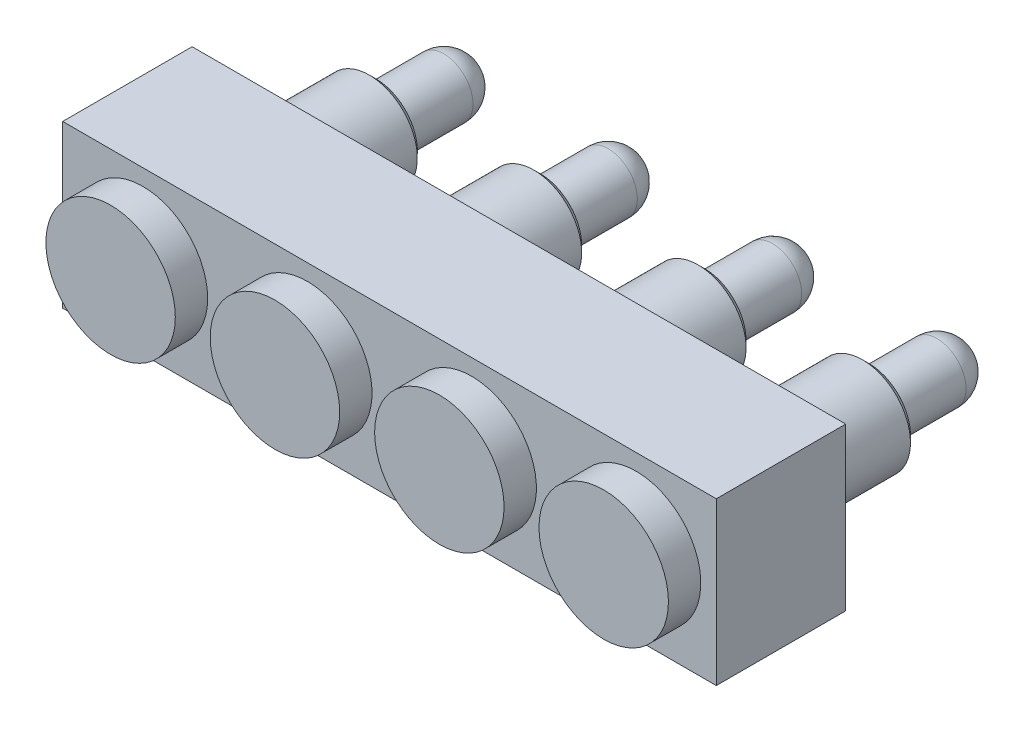
ISO-10303-21;
HEADER;
FILE_DESCRIPTION(('STEP AP214'),'2;1');
FILE_NAME('part.step','',(''),(''),'','','');
FILE_SCHEMA(('AUTOMOTIVE_DESIGN { 1 0 10303 214 1 1 1 1 }'));
ENDSEC;
DATA;
#1=APPLICATION_CONTEXT('core data for automotive mechanical design processes');
#2=APPLICATION_PROTOCOL_DEFINITION('international standard','automotive_design',2000,#1);
#3=PRODUCT_CONTEXT('',#1,'mechanical');
#4=PRODUCT('Part','Part','',(#3));
#5=PRODUCT_RELATED_PRODUCT_CATEGORY('part','',(#4));
#6=PRODUCT_DEFINITION_FORMATION('','',#4);
#7=PRODUCT_DEFINITION_CONTEXT('part definition',#1,'design');
#8=PRODUCT_DEFINITION('design','',#6,#7);
#9=PRODUCT_DEFINITION_SHAPE('','',#8);
#10=(LENGTH_UNIT() NAMED_UNIT(*) SI_UNIT(.MILLI.,.METRE.));
#11=(NAMED_UNIT(*) PLANE_ANGLE_UNIT() SI_UNIT($,.RADIAN.));
#12=(NAMED_UNIT(*) SI_UNIT($,.STERADIAN.) SOLID_ANGLE_UNIT());
#13=UNCERTAINTY_MEASURE_WITH_UNIT(LENGTH_MEASURE(1.E-05),#10,'distance_accuracy_value','');
#14=(GEOMETRIC_REPRESENTATION_CONTEXT(3) GLOBAL_UNCERTAINTY_ASSIGNED_CONTEXT((#13)) GLOBAL_UNIT_ASSIGNED_CONTEXT((#10,
#11,#12)) REPRESENTATION_CONTEXT('',''));
#15=CARTESIAN_POINT('',(0.,0.,0.));
#16=DIRECTION('',(0.,0.,1.));
#17=DIRECTION('',(1.,0.,0.));
#18=AXIS2_PLACEMENT_3D('',#15,#16,#17);
#19=CARTESIAN_POINT('',(8.86405892984329,1.25248156690926,-1.6));
#20=DIRECTION('',(0.,0.,1.));
#21=DIRECTION('',(1.,0.,0.));
#22=AXIS2_PLACEMENT_3D('',#19,#20,#21);
#23=CYLINDRICAL_SURFACE('',#22,0.74);
#24=CARTESIAN_POINT('',(8.86405892984329,1.25248156690926,-1.5));
#25=DIRECTION('',(0.,0.,-1.));
#26=DIRECTION('',(-1.,0.,0.));
#27=AXIS2_PLACEMENT_3D('',#24,#25,#26);
#28=CIRCLE('',#27,0.74);
#29=CARTESIAN_POINT('',(8.12405892984329,1.25248156690926,-1.5));
#30=VERTEX_POINT('',#29);
#31=EDGE_CURVE('E11',#30,#30,#28,.F.);
#32=ORIENTED_EDGE('',*,*,#31,.T.);
#33=EDGE_LOOP('',(#32));
#34=FACE_BOUND('',#33,.T.);
#35=CARTESIAN_POINT('',(8.86405892984329,1.25248156690926,0.));
#36=DIRECTION('',(0.,0.,-1.));
#37=DIRECTION('',(-1.,0.,0.));
#38=AXIS2_PLACEMENT_3D('',#35,#36,#37);
#39=CIRCLE('',#38,0.74);
#40=CARTESIAN_POINT('',(8.12405892984329,1.25248156690926,0.));
#41=VERTEX_POINT('',#40);
#42=EDGE_CURVE('E74',#41,#41,#39,.T.);
#43=ORIENTED_EDGE('',*,*,#42,.T.);
#44=EDGE_LOOP('',(#43));
#45=FACE_BOUND('',#44,.T.);
#46=ADVANCED_FACE('F58',(#34,#45),#23,.T.);
#47=CARTESIAN_POINT('',(8.86405892984329,1.25248156690926,-1.6));
#48=DIRECTION('',(0.,0.,-1.));
#49=DIRECTION('',(-1.,0.,0.));
#50=AXIS2_PLACEMENT_3D('',#47,#48,#49);
#51=PLANE('',#50);
#52=CARTESIAN_POINT('',(8.86405892984329,1.25248156690926,-1.6));
#53=DIRECTION('',(0.,0.,-1.));
#54=DIRECTION('',(-1.,0.,0.));
#55=AXIS2_PLACEMENT_3D('',#52,#53,#54);
#56=CIRCLE('',#55,0.64);
#57=CARTESIAN_POINT('',(8.22405892984329,1.25248156690926,-1.6));
#58=VERTEX_POINT('',#57);
#59=EDGE_CURVE('E66',#58,#58,#56,.T.);
#60=ORIENTED_EDGE('',*,*,#59,.T.);
#61=EDGE_LOOP('',(#60));
#62=FACE_BOUND('',#61,.T.);
#63=CARTESIAN_POINT('',(8.86405892984329,1.25248156690931,-1.6));
#64=DIRECTION('',(0.,0.,-1.));
#65=DIRECTION('',(-1.,0.,0.));
#66=AXIS2_PLACEMENT_3D('',#63,#64,#65);
#67=CIRCLE('',#66,0.45);
#68=CARTESIAN_POINT('',(8.41405892984329,1.25248156690931,-1.6));
#69=VERTEX_POINT('',#68);
#70=EDGE_CURVE('E79',#69,#69,#67,.F.);
#71=ORIENTED_EDGE('',*,*,#70,.T.);
#72=EDGE_LOOP('',(#71));
#73=FACE_BOUND('',#72,.T.);
#74=ADVANCED_FACE('F83',(#62,#73),#51,.T.);
#75=CARTESIAN_POINT('',(8.86405892984329,1.25248156690926,0.));
#76=DIRECTION('',(0.,0.,-1.));
#77=DIRECTION('',(-1.,0.,0.));
#78=AXIS2_PLACEMENT_3D('',#75,#76,#77);
#79=PLANE('',#78);
#80=ORIENTED_EDGE('',*,*,#42,.F.);
#81=EDGE_LOOP('',(#80));
#82=FACE_BOUND('',#81,.T.);
#83=ADVANCED_FACE('F88',(#82),#79,.F.);
#84=CARTESIAN_POINT('',(8.86405892984329,1.25248156690931,-3.1));
#85=DIRECTION('',(0.,0.,1.));
#86=DIRECTION('',(1.,0.,0.));
#87=AXIS2_PLACEMENT_3D('',#84,#85,#86);
#88=CYLINDRICAL_SURFACE('',#87,0.45);
#89=CARTESIAN_POINT('',(8.86405892984329,1.25248156690931,-2.65));
#90=DIRECTION('',(0.,0.,1.));
#91=DIRECTION('',(1.,0.,0.));
#92=AXIS2_PLACEMENT_3D('',#89,#90,#91);
#93=CIRCLE('',#92,0.45);
#94=CARTESIAN_POINT('',(9.31405892984329,1.25248156690931,-2.65));
#95=VERTEX_POINT('',#94);
#96=EDGE_CURVE('E70',#95,#95,#93,.T.);
#97=ORIENTED_EDGE('',*,*,#96,.T.);
#98=EDGE_LOOP('',(#97));
#99=FACE_BOUND('',#98,.T.);
#100=ORIENTED_EDGE('',*,*,#70,.F.);
#101=EDGE_LOOP('',(#100));
#102=FACE_BOUND('',#101,.T.);
#103=ADVANCED_FACE('F85',(#99,#102),#88,.T.);
#104=CARTESIAN_POINT('',(8.86405892984329,1.25248156690931,-2.65));
#105=DIRECTION('',(0.,0.,-1.));
#106=DIRECTION('',(-1.,0.,0.));
#107=AXIS2_PLACEMENT_3D('',#104,#105,#106);
#108=SPHERICAL_SURFACE('',#107,0.45);
#109=ORIENTED_EDGE('',*,*,#96,.F.);
#110=EDGE_LOOP('',(#109));
#111=FACE_BOUND('',#110,.T.);
#112=ADVANCED_FACE('F87',(#111),#108,.T.);
#113=CARTESIAN_POINT('',(8.86405892984329,1.25248156690926,-1.6));
#114=DIRECTION('',(0.,0.,1.));
#115=DIRECTION('',(1.,0.,0.));
#116=AXIS2_PLACEMENT_3D('',#113,#114,#115);
#117=CONICAL_SURFACE('',#116,0.64,0.78539816339744);
#118=ORIENTED_EDGE('',*,*,#31,.F.);
#119=EDGE_LOOP('',(#118));
#120=FACE_BOUND('',#119,.T.);
#121=ORIENTED_EDGE('',*,*,#59,.F.);
#122=EDGE_LOOP('',(#121));
#123=FACE_BOUND('',#122,.T.);
#124=ADVANCED_FACE('F61',(#120,#123),#117,.T.);
#125=CLOSED_SHELL('',(#46,#74,#83,#103,#112,#124));
#126=MANIFOLD_SOLID_BREP('B2',#125);
#127=CARTESIAN_POINT('',(6.32405892984329,1.25248156690928,-1.6));
#128=DIRECTION('',(0.,0.,1.));
#129=DIRECTION('',(1.,0.,0.));
#130=AXIS2_PLACEMENT_3D('',#127,#128,#129);
#131=CYLINDRICAL_SURFACE('',#130,0.740000000000001);
#132=CARTESIAN_POINT('',(6.32405892984329,1.25248156690928,-1.5));
#133=DIRECTION('',(0.,0.,-1.));
#134=DIRECTION('',(-1.,0.,0.));
#135=AXIS2_PLACEMENT_3D('',#132,#133,#134);
#136=CIRCLE('',#135,0.740000000000001);
#137=CARTESIAN_POINT('',(5.58405892984329,1.25248156690928,-1.5));
#138=VERTEX_POINT('',#137);
#139=EDGE_CURVE('E57',#138,#138,#136,.F.);
#140=ORIENTED_EDGE('',*,*,#139,.T.);
#141=EDGE_LOOP('',(#140));
#142=FACE_BOUND('',#141,.T.);
#143=CARTESIAN_POINT('',(6.32405892984329,1.25248156690928,0.));
#144=DIRECTION('',(0.,0.,-1.));
#145=DIRECTION('',(-1.,0.,0.));
#146=AXIS2_PLACEMENT_3D('',#143,#144,#145);
#147=CIRCLE('',#146,0.740000000000001);
#148=CARTESIAN_POINT('',(5.58405892984329,1.25248156690928,0.));
#149=VERTEX_POINT('',#148);
#150=EDGE_CURVE('E159',#149,#149,#147,.T.);
#151=ORIENTED_EDGE('',*,*,#150,.T.);
#152=EDGE_LOOP('',(#151));
#153=FACE_BOUND('',#152,.T.);
#154=ADVANCED_FACE('F143',(#142,#153),#131,.T.);
#155=CARTESIAN_POINT('',(6.32405892984329,1.25248156690928,-1.6));
#156=DIRECTION('',(0.,0.,-1.));
#157=DIRECTION('',(-1.,0.,0.));
#158=AXIS2_PLACEMENT_3D('',#155,#156,#157);
#159=PLANE('',#158);
#160=CARTESIAN_POINT('',(6.32405892984329,1.25248156690928,-1.6));
#161=DIRECTION('',(0.,0.,-1.));
#162=DIRECTION('',(-1.,0.,0.));
#163=AXIS2_PLACEMENT_3D('',#160,#161,#162);
#164=CIRCLE('',#163,0.640000000000002);
#165=CARTESIAN_POINT('',(5.68405892984329,1.25248156690928,-1.6));
#166=VERTEX_POINT('',#165);
#167=EDGE_CURVE('E151',#166,#166,#164,.T.);
#168=ORIENTED_EDGE('',*,*,#167,.T.);
#169=EDGE_LOOP('',(#168));
#170=FACE_BOUND('',#169,.T.);
#171=CARTESIAN_POINT('',(6.32405892984329,1.25248156690935,-1.6));
#172=DIRECTION('',(0.,0.,-1.));
#173=DIRECTION('',(-1.,0.,0.));
#174=AXIS2_PLACEMENT_3D('',#171,#172,#173);
#175=CIRCLE('',#174,0.45);
#176=CARTESIAN_POINT('',(5.87405892984329,1.25248156690935,-1.6));
#177=VERTEX_POINT('',#176);
#178=EDGE_CURVE('E164',#177,#177,#175,.F.);
#179=ORIENTED_EDGE('',*,*,#178,.T.);
#180=EDGE_LOOP('',(#179));
#181=FACE_BOUND('',#180,.T.);
#182=ADVANCED_FACE('F168',(#170,#181),#159,.T.);
#183=CARTESIAN_POINT('',(6.32405892984329,1.25248156690928,0.));
#184=DIRECTION('',(0.,0.,-1.));
#185=DIRECTION('',(-1.,0.,0.));
#186=AXIS2_PLACEMENT_3D('',#183,#184,#185);
#187=PLANE('',#186);
#188=ORIENTED_EDGE('',*,*,#150,.F.);
#189=EDGE_LOOP('',(#188));
#190=FACE_BOUND('',#189,.T.);
#191=ADVANCED_FACE('F173',(#190),#187,.F.);
#192=CARTESIAN_POINT('',(6.32405892984329,1.25248156690935,-3.1));
#193=DIRECTION('',(0.,0.,1.));
#194=DIRECTION('',(1.,0.,0.));
#195=AXIS2_PLACEMENT_3D('',#192,#193,#194);
#196=CYLINDRICAL_SURFACE('',#195,0.45);
#197=CARTESIAN_POINT('',(6.32405892984329,1.25248156690935,-2.65));
#198=DIRECTION('',(0.,0.,1.));
#199=DIRECTION('',(1.,0.,0.));
#200=AXIS2_PLACEMENT_3D('',#197,#198,#199);
#201=CIRCLE('',#200,0.45);
#202=CARTESIAN_POINT('',(6.77405892984329,1.25248156690935,-2.65));
#203=VERTEX_POINT('',#202);
#204=EDGE_CURVE('E155',#203,#203,#201,.T.);
#205=ORIENTED_EDGE('',*,*,#204,.T.);
#206=EDGE_LOOP('',(#205));
#207=FACE_BOUND('',#206,.T.);
#208=ORIENTED_EDGE('',*,*,#178,.F.);
#209=EDGE_LOOP('',(#208));
#210=FACE_BOUND('',#209,.T.);
#211=ADVANCED_FACE('F170',(#207,#210),#196,.T.);
#212=CARTESIAN_POINT('',(6.32405892984329,1.25248156690935,-2.65));
#213=DIRECTION('',(0.,0.,-1.));
#214=DIRECTION('',(-1.,0.,0.));
#215=AXIS2_PLACEMENT_3D('',#212,#213,#214);
#216=SPHERICAL_SURFACE('',#215,0.45);
#217=ORIENTED_EDGE('',*,*,#204,.F.);
#218=EDGE_LOOP('',(#217));
#219=FACE_BOUND('',#218,.T.);
#220=ADVANCED_FACE('F172',(#219),#216,.T.);
#221=CARTESIAN_POINT('',(6.32405892984329,1.25248156690928,-1.6));
#222=DIRECTION('',(0.,0.,1.));
#223=DIRECTION('',(1.,0.,0.));
#224=AXIS2_PLACEMENT_3D('',#221,#222,#223);
#225=CONICAL_SURFACE('',#224,0.640000000000002,0.78539816339745);
#226=ORIENTED_EDGE('',*,*,#139,.F.);
#227=EDGE_LOOP('',(#226));
#228=FACE_BOUND('',#227,.T.);
#229=ORIENTED_EDGE('',*,*,#167,.F.);
#230=EDGE_LOOP('',(#229));
#231=FACE_BOUND('',#230,.T.);
#232=ADVANCED_FACE('F146',(#228,#231),#225,.T.);
#233=CLOSED_SHELL('',(#154,#182,#191,#211,#220,#232));
#234=MANIFOLD_SOLID_BREP('B6',#233);
#235=CARTESIAN_POINT('',(3.78405892984329,1.25248156690929,-1.6));
#236=DIRECTION('',(0.,0.,1.));
#237=DIRECTION('',(1.,0.,0.));
#238=AXIS2_PLACEMENT_3D('',#235,#236,#237);
#239=CYLINDRICAL_SURFACE('',#238,0.74);
#240=CARTESIAN_POINT('',(3.78405892984329,1.25248156690929,-1.5));
#241=DIRECTION('',(0.,0.,-1.));
#242=DIRECTION('',(-1.,0.,0.));
#243=AXIS2_PLACEMENT_3D('',#240,#241,#242);
#244=CIRCLE('',#243,0.74);
#245=CARTESIAN_POINT('',(3.04405892984329,1.25248156690929,-1.5));
#246=VERTEX_POINT('',#245);
#247=EDGE_CURVE('E142',#246,#246,#244,.F.);
#248=ORIENTED_EDGE('',*,*,#247,.T.);
#249=EDGE_LOOP('',(#248));
#250=FACE_BOUND('',#249,.T.);
#251=CARTESIAN_POINT('',(3.78405892984329,1.25248156690929,0.));
#252=DIRECTION('',(0.,0.,-1.));
#253=DIRECTION('',(-1.,0.,0.));
#254=AXIS2_PLACEMENT_3D('',#251,#252,#253);
#255=CIRCLE('',#254,0.74);
#256=CARTESIAN_POINT('',(3.04405892984329,1.25248156690929,0.));
#257=VERTEX_POINT('',#256);
#258=EDGE_CURVE('E244',#257,#257,#255,.T.);
#259=ORIENTED_EDGE('',*,*,#258,.T.);
#260=EDGE_LOOP('',(#259));
#261=FACE_BOUND('',#260,.T.);
#262=ADVANCED_FACE('F228',(#250,#261),#239,.T.);
#263=CARTESIAN_POINT('',(3.78405892984329,1.25248156690929,-1.6));
#264=DIRECTION('',(0.,0.,-1.));
#265=DIRECTION('',(-1.,0.,0.));
#266=AXIS2_PLACEMENT_3D('',#263,#264,#265);
#267=PLANE('',#266);
#268=CARTESIAN_POINT('',(3.78405892984329,1.25248156690929,-1.6));
#269=DIRECTION('',(0.,0.,-1.));
#270=DIRECTION('',(-1.,0.,0.));
#271=AXIS2_PLACEMENT_3D('',#268,#269,#270);
#272=CIRCLE('',#271,0.639999999999999);
#273=CARTESIAN_POINT('',(3.14405892984329,1.25248156690929,-1.6));
#274=VERTEX_POINT('',#273);
#275=EDGE_CURVE('E236',#274,#274,#272,.T.);
#276=ORIENTED_EDGE('',*,*,#275,.T.);
#277=EDGE_LOOP('',(#276));
#278=FACE_BOUND('',#277,.T.);
#279=CARTESIAN_POINT('',(3.78405892984329,1.25248156690938,-1.6));
#280=DIRECTION('',(0.,0.,-1.));
#281=DIRECTION('',(-1.,0.,0.));
#282=AXIS2_PLACEMENT_3D('',#279,#280,#281);
#283=CIRCLE('',#282,0.45);
#284=CARTESIAN_POINT('',(3.33405892984329,1.25248156690938,-1.6));
#285=VERTEX_POINT('',#284);
#286=EDGE_CURVE('E249',#285,#285,#283,.F.);
#287=ORIENTED_EDGE('',*,*,#286,.T.);
#288=EDGE_LOOP('',(#287));
#289=FACE_BOUND('',#288,.T.);
#290=ADVANCED_FACE('F253',(#278,#289),#267,.T.);
#291=CARTESIAN_POINT('',(3.78405892984329,1.25248156690929,0.));
#292=DIRECTION('',(0.,0.,-1.));
#293=DIRECTION('',(-1.,0.,0.));
#294=AXIS2_PLACEMENT_3D('',#291,#292,#293);
#295=PLANE('',#294);
#296=ORIENTED_EDGE('',*,*,#258,.F.);
#297=EDGE_LOOP('',(#296));
#298=FACE_BOUND('',#297,.T.);
#299=ADVANCED_FACE('F258',(#298),#295,.F.);
#300=CARTESIAN_POINT('',(3.78405892984329,1.25248156690938,-3.1));
#301=DIRECTION('',(0.,0.,1.));
#302=DIRECTION('',(1.,0.,0.));
#303=AXIS2_PLACEMENT_3D('',#300,#301,#302);
#304=CYLINDRICAL_SURFACE('',#303,0.45);
#305=CARTESIAN_POINT('',(3.78405892984329,1.25248156690938,-2.65));
#306=DIRECTION('',(0.,0.,1.));
#307=DIRECTION('',(1.,0.,0.));
#308=AXIS2_PLACEMENT_3D('',#305,#306,#307);
#309=CIRCLE('',#308,0.45);
#310=CARTESIAN_POINT('',(4.23405892984329,1.25248156690938,-2.65));
#311=VERTEX_POINT('',#310);
#312=EDGE_CURVE('E240',#311,#311,#309,.T.);
#313=ORIENTED_EDGE('',*,*,#312,.T.);
#314=EDGE_LOOP('',(#313));
#315=FACE_BOUND('',#314,.T.);
#316=ORIENTED_EDGE('',*,*,#286,.F.);
#317=EDGE_LOOP('',(#316));
#318=FACE_BOUND('',#317,.T.);
#319=ADVANCED_FACE('F255',(#315,#318),#304,.T.);
#320=CARTESIAN_POINT('',(3.78405892984329,1.25248156690938,-2.65));
#321=DIRECTION('',(0.,0.,-1.));
#322=DIRECTION('',(-1.,0.,0.));
#323=AXIS2_PLACEMENT_3D('',#320,#321,#322);
#324=SPHERICAL_SURFACE('',#323,0.45);
#325=ORIENTED_EDGE('',*,*,#312,.F.);
#326=EDGE_LOOP('',(#325));
#327=FACE_BOUND('',#326,.T.);
#328=ADVANCED_FACE('F257',(#327),#324,.T.);
#329=CARTESIAN_POINT('',(3.78405892984329,1.25248156690929,-1.6));
#330=DIRECTION('',(0.,0.,1.));
#331=DIRECTION('',(1.,0.,0.));
#332=AXIS2_PLACEMENT_3D('',#329,#330,#331);
#333=CONICAL_SURFACE('',#332,0.639999999999999,0.78539816339745);
#334=ORIENTED_EDGE('',*,*,#247,.F.);
#335=EDGE_LOOP('',(#334));
#336=FACE_BOUND('',#335,.T.);
#337=ORIENTED_EDGE('',*,*,#275,.F.);
#338=EDGE_LOOP('',(#337));
#339=FACE_BOUND('',#338,.T.);
#340=ADVANCED_FACE('F231',(#336,#339),#333,.T.);
#341=CLOSED_SHELL('',(#262,#290,#299,#319,#328,#340));
#342=MANIFOLD_SOLID_BREP('B52',#341);
#343=CARTESIAN_POINT('',(1.24405892984329,1.25248156690931,-1.6));
#344=DIRECTION('',(0.,0.,1.));
#345=DIRECTION('',(1.,0.,0.));
#346=AXIS2_PLACEMENT_3D('',#343,#344,#345);
#347=CYLINDRICAL_SURFACE('',#346,0.74);
#348=CARTESIAN_POINT('',(1.24405892984329,1.25248156690931,-1.5));
#349=DIRECTION('',(0.,0.,-1.));
#350=DIRECTION('',(-1.,0.,0.));
#351=AXIS2_PLACEMENT_3D('',#348,#349,#350);
#352=CIRCLE('',#351,0.74);
#353=CARTESIAN_POINT('',(0.504058929843292,1.25248156690931,-1.5));
#354=VERTEX_POINT('',#353);
#355=EDGE_CURVE('E227',#354,#354,#352,.F.);
#356=ORIENTED_EDGE('',*,*,#355,.T.);
#357=EDGE_LOOP('',(#356));
#358=FACE_BOUND('',#357,.T.);
#359=CARTESIAN_POINT('',(1.24405892984329,1.25248156690931,0.));
#360=DIRECTION('',(0.,0.,-1.));
#361=DIRECTION('',(-1.,0.,0.));
#362=AXIS2_PLACEMENT_3D('',#359,#360,#361);
#363=CIRCLE('',#362,0.74);
#364=CARTESIAN_POINT('',(0.504058929843292,1.25248156690931,0.));
#365=VERTEX_POINT('',#364);
#366=EDGE_CURVE('E330',#365,#365,#363,.T.);
#367=ORIENTED_EDGE('',*,*,#366,.T.);
#368=EDGE_LOOP('',(#367));
#369=FACE_BOUND('',#368,.T.);
#370=ADVANCED_FACE('F314',(#358,#369),#347,.T.);
#371=CARTESIAN_POINT('',(1.24405892984329,1.25248156690931,-1.6));
#372=DIRECTION('',(0.,0.,-1.));
#373=DIRECTION('',(-1.,0.,0.));
#374=AXIS2_PLACEMENT_3D('',#371,#372,#373);
#375=PLANE('',#374);
#376=CARTESIAN_POINT('',(1.24405892984329,1.25248156690931,-1.6));
#377=DIRECTION('',(0.,0.,-1.));
#378=DIRECTION('',(-1.,0.,0.));
#379=AXIS2_PLACEMENT_3D('',#376,#377,#378);
#380=CIRCLE('',#379,0.640000000000001);
#381=CARTESIAN_POINT('',(0.604058929843291,1.25248156690931,-1.6));
#382=VERTEX_POINT('',#381);
#383=EDGE_CURVE('E322',#382,#382,#380,.T.);
#384=ORIENTED_EDGE('',*,*,#383,.T.);
#385=EDGE_LOOP('',(#384));
#386=FACE_BOUND('',#385,.T.);
#387=CARTESIAN_POINT('',(1.24405892984329,1.25248156690942,-1.6));
#388=DIRECTION('',(0.,0.,-1.));
#389=DIRECTION('',(-1.,0.,0.));
#390=AXIS2_PLACEMENT_3D('',#387,#388,#389);
#391=CIRCLE('',#390,0.45);
#392=CARTESIAN_POINT('',(0.794058929843293,1.25248156690942,-1.6));
#393=VERTEX_POINT('',#392);
#394=EDGE_CURVE('E335',#393,#393,#391,.F.);
#395=ORIENTED_EDGE('',*,*,#394,.T.);
#396=EDGE_LOOP('',(#395));
#397=FACE_BOUND('',#396,.T.);
#398=ADVANCED_FACE('F339',(#386,#397),#375,.T.);
#399=CARTESIAN_POINT('',(1.24405892984329,1.25248156690931,0.));
#400=DIRECTION('',(0.,0.,-1.));
#401=DIRECTION('',(-1.,0.,0.));
#402=AXIS2_PLACEMENT_3D('',#399,#400,#401);
#403=PLANE('',#402);
#404=ORIENTED_EDGE('',*,*,#366,.F.);
#405=EDGE_LOOP('',(#404));
#406=FACE_BOUND('',#405,.T.);
#407=ADVANCED_FACE('F344',(#406),#403,.F.);
#408=CARTESIAN_POINT('',(1.24405892984329,1.25248156690942,-3.1));
#409=DIRECTION('',(0.,0.,1.));
#410=DIRECTION('',(1.,0.,0.));
#411=AXIS2_PLACEMENT_3D('',#408,#409,#410);
#412=CYLINDRICAL_SURFACE('',#411,0.45);
#413=CARTESIAN_POINT('',(1.24405892984329,1.25248156690942,-2.65));
#414=DIRECTION('',(0.,0.,1.));
#415=DIRECTION('',(1.,0.,0.));
#416=AXIS2_PLACEMENT_3D('',#413,#414,#415);
#417=CIRCLE('',#416,0.45);
#418=CARTESIAN_POINT('',(1.69405892984329,1.25248156690942,-2.65));
#419=VERTEX_POINT('',#418);
#420=EDGE_CURVE('E326',#419,#419,#417,.T.);
#421=ORIENTED_EDGE('',*,*,#420,.T.);
#422=EDGE_LOOP('',(#421));
#423=FACE_BOUND('',#422,.T.);
#424=ORIENTED_EDGE('',*,*,#394,.F.);
#425=EDGE_LOOP('',(#424));
#426=FACE_BOUND('',#425,.T.);
#427=ADVANCED_FACE('F341',(#423,#426),#412,.T.);
#428=CARTESIAN_POINT('',(1.24405892984329,1.25248156690942,-2.65));
#429=DIRECTION('',(0.,0.,-1.));
#430=DIRECTION('',(-1.,0.,0.));
#431=AXIS2_PLACEMENT_3D('',#428,#429,#430);
#432=SPHERICAL_SURFACE('',#431,0.45);
#433=ORIENTED_EDGE('',*,*,#420,.F.);
#434=EDGE_LOOP('',(#433));
#435=FACE_BOUND('',#434,.T.);
#436=ADVANCED_FACE('F343',(#435),#432,.T.);
#437=CARTESIAN_POINT('',(1.24405892984329,1.25248156690931,-1.6));
#438=DIRECTION('',(0.,0.,1.));
#439=DIRECTION('',(1.,0.,0.));
#440=AXIS2_PLACEMENT_3D('',#437,#438,#439);
#441=CONICAL_SURFACE('',#440,0.640000000000001,0.785398163397446);
#442=ORIENTED_EDGE('',*,*,#355,.F.);
#443=EDGE_LOOP('',(#442));
#444=FACE_BOUND('',#443,.T.);
#445=ORIENTED_EDGE('',*,*,#383,.F.);
#446=EDGE_LOOP('',(#445));
#447=FACE_BOUND('',#446,.T.);
#448=ADVANCED_FACE('F317',(#444,#447),#441,.T.);
#449=CLOSED_SHELL('',(#370,#398,#407,#427,#436,#448));
#450=MANIFOLD_SOLID_BREP('B137',#449);
#451=CARTESIAN_POINT('',(0.,0.,2.));
#452=DIRECTION('',(0.,0.,-1.));
#453=DIRECTION('',(-1.,0.,0.));
#454=AXIS2_PLACEMENT_3D('',#451,#452,#453);
#455=PLANE('',#454);
#456=CARTESIAN_POINT('',(8.86405892984329,1.25248156690931,2.));
#457=DIRECTION('',(0.,0.,-1.));
#458=DIRECTION('',(-1.,0.,0.));
#459=AXIS2_PLACEMENT_3D('',#456,#457,#458);
#460=CIRCLE('',#459,1.);
#461=CARTESIAN_POINT('',(7.86405892984329,1.25248156690931,2.));
#462=VERTEX_POINT('',#461);
#463=EDGE_CURVE('E312',#462,#462,#460,.F.);
#464=ORIENTED_EDGE('',*,*,#463,.F.);
#465=EDGE_LOOP('',(#464));
#466=FACE_BOUND('',#465,.T.);
#467=CARTESIAN_POINT('',(6.32405892984329,1.25248156690931,2.));
#468=DIRECTION('',(0.,0.,-1.));
#469=DIRECTION('',(-1.,0.,0.));
#470=AXIS2_PLACEMENT_3D('',#467,#468,#469);
#471=CIRCLE('',#470,1.);
#472=CARTESIAN_POINT('',(5.32405892984329,1.25248156690931,2.));
#473=VERTEX_POINT('',#472);
#474=EDGE_CURVE('E401',#473,#473,#471,.F.);
#475=ORIENTED_EDGE('',*,*,#474,.F.);
#476=EDGE_LOOP('',(#475));
#477=FACE_BOUND('',#476,.T.);
#478=CARTESIAN_POINT('',(3.78405892984329,1.25248156690931,2.));
#479=DIRECTION('',(0.,0.,-1.));
#480=DIRECTION('',(-1.,0.,0.));
#481=AXIS2_PLACEMENT_3D('',#478,#479,#480);
#482=CIRCLE('',#481,1.);
#483=CARTESIAN_POINT('',(2.78405892984329,1.25248156690931,2.));
#484=VERTEX_POINT('',#483);
#485=EDGE_CURVE('E481',#484,#484,#482,.F.);
#486=ORIENTED_EDGE('',*,*,#485,.F.);
#487=EDGE_LOOP('',(#486));
#488=FACE_BOUND('',#487,.T.);
#489=CARTESIAN_POINT('',(1.24405892984329,1.25248156690931,2.));
#490=DIRECTION('',(0.,0.,1.));
#491=DIRECTION('',(1.,0.,0.));
#492=AXIS2_PLACEMENT_3D('',#489,#490,#491);
#493=CIRCLE('',#492,1.);
#494=CARTESIAN_POINT('',(2.24405892984329,1.25248156690931,2.));
#495=VERTEX_POINT('',#494);
#496=EDGE_CURVE('E480',#495,#495,#493,.T.);
#497=ORIENTED_EDGE('',*,*,#496,.F.);
#498=EDGE_LOOP('',(#497));
#499=FACE_BOUND('',#498,.T.);
#500=DIRECTION('',(0.,-1.,0.));
#501=VECTOR('',#500,1.);
#502=CARTESIAN_POINT('',(0.00405892984328259,0.0024815669093473,2.));
#503=LINE('',#502,#501);
#504=CARTESIAN_POINT('',(0.00405892984328263,2.50248156690935,2.));
#505=VERTEX_POINT('',#504);
#506=CARTESIAN_POINT('',(0.00405892984328259,0.0024815669093473,2.));
#507=VERTEX_POINT('',#506);
#508=EDGE_CURVE('E444',#505,#507,#503,.T.);
#509=ORIENTED_EDGE('',*,*,#508,.T.);
#510=DIRECTION('',(1.,0.,0.));
#511=VECTOR('',#510,1.);
#512=CARTESIAN_POINT('',(0.00405892984328259,0.0024815669093473,2.));
#513=LINE('',#512,#511);
#514=CARTESIAN_POINT('',(10.1040589298433,0.0024815669093473,2.));
#515=VERTEX_POINT('',#514);
#516=EDGE_CURVE('E440',#507,#515,#513,.T.);
#517=ORIENTED_EDGE('',*,*,#516,.T.);
#518=DIRECTION('',(0.,1.,0.));
#519=VECTOR('',#518,1.);
#520=CARTESIAN_POINT('',(10.1040589298433,0.0024815669093473,2.));
#521=LINE('',#520,#519);
#522=CARTESIAN_POINT('',(10.1040589298433,2.50248156690935,2.));
#523=VERTEX_POINT('',#522);
#524=EDGE_CURVE('E442',#515,#523,#521,.T.);
#525=ORIENTED_EDGE('',*,*,#524,.T.);
#526=DIRECTION('',(-1.,0.,0.));
#527=VECTOR('',#526,1.);
#528=CARTESIAN_POINT('',(0.00405892984328263,2.50248156690935,2.));
#529=LINE('',#528,#527);
#530=EDGE_CURVE('E409',#523,#505,#529,.T.);
#531=ORIENTED_EDGE('',*,*,#530,.T.);
#532=EDGE_LOOP('',(#509,#517,#525,#531));
#533=FACE_BOUND('',#532,.T.);
#534=ADVANCED_FACE('F391',(#466,#477,#488,#499,#533),#455,.F.);
#535=CARTESIAN_POINT('',(0.,0.,0.));
#536=DIRECTION('',(0.,0.,-1.));
#537=DIRECTION('',(-1.,0.,0.));
#538=AXIS2_PLACEMENT_3D('',#535,#536,#537);
#539=PLANE('',#538);
#540=CARTESIAN_POINT('',(1.24405892984329,1.25248156690931,0.));
#541=DIRECTION('',(0.,0.,1.));
#542=DIRECTION('',(1.,0.,0.));
#543=AXIS2_PLACEMENT_3D('',#540,#541,#542);
#544=CIRCLE('',#543,0.74);
#545=CARTESIAN_POINT('',(1.98405892984329,1.25248156690931,0.));
#546=VERTEX_POINT('',#545);
#547=EDGE_CURVE('E510',#546,#546,#544,.T.);
#548=ORIENTED_EDGE('',*,*,#547,.T.);
#549=EDGE_LOOP('',(#548));
#550=FACE_BOUND('',#549,.T.);
#551=CARTESIAN_POINT('',(3.78405892984329,1.25248156690933,0.));
#552=DIRECTION('',(0.,0.,1.));
#553=DIRECTION('',(1.,0.,0.));
#554=AXIS2_PLACEMENT_3D('',#551,#552,#553);
#555=CIRCLE('',#554,0.74);
#556=CARTESIAN_POINT('',(4.52405892984329,1.25248156690933,0.));
#557=VERTEX_POINT('',#556);
#558=EDGE_CURVE('E467',#557,#557,#555,.T.);
#559=ORIENTED_EDGE('',*,*,#558,.T.);
#560=EDGE_LOOP('',(#559));
#561=FACE_BOUND('',#560,.T.);
#562=DIRECTION('',(0.,-1.,0.));
#563=VECTOR('',#562,1.);
#564=CARTESIAN_POINT('',(0.00405892984328259,0.0024815669093473,0.));
#565=LINE('',#564,#563);
#566=CARTESIAN_POINT('',(0.00405892984328263,2.50248156690935,0.));
#567=VERTEX_POINT('',#566);
#568=CARTESIAN_POINT('',(0.00405892984328259,0.0024815669093473,0.));
#569=VERTEX_POINT('',#568);
#570=EDGE_CURVE('E463',#567,#569,#565,.T.);
#571=ORIENTED_EDGE('',*,*,#570,.F.);
#572=DIRECTION('',(-1.,0.,0.));
#573=VECTOR('',#572,1.);
#574=CARTESIAN_POINT('',(0.00405892984328263,2.50248156690935,0.));
#575=LINE('',#574,#573);
#576=CARTESIAN_POINT('',(10.1040589298433,2.50248156690935,0.));
#577=VERTEX_POINT('',#576);
#578=EDGE_CURVE('E432',#577,#567,#575,.T.);
#579=ORIENTED_EDGE('',*,*,#578,.F.);
#580=DIRECTION('',(0.,1.,0.));
#581=VECTOR('',#580,1.);
#582=CARTESIAN_POINT('',(10.1040589298433,0.0024815669093473,0.));
#583=LINE('',#582,#581);
#584=CARTESIAN_POINT('',(10.1040589298433,0.0024815669093473,0.));
#585=VERTEX_POINT('',#584);
#586=EDGE_CURVE('E426',#585,#577,#583,.T.);
#587=ORIENTED_EDGE('',*,*,#586,.F.);
#588=DIRECTION('',(1.,0.,0.));
#589=VECTOR('',#588,1.);
#590=CARTESIAN_POINT('',(0.00405892984328259,0.0024815669093473,0.));
#591=LINE('',#590,#589);
#592=EDGE_CURVE('E450',#569,#585,#591,.T.);
#593=ORIENTED_EDGE('',*,*,#592,.F.);
#594=EDGE_LOOP('',(#571,#579,#587,#593));
#595=FACE_BOUND('',#594,.T.);
#596=CARTESIAN_POINT('',(8.86405892984329,1.25248156690931,0.));
#597=DIRECTION('',(0.,0.,1.));
#598=DIRECTION('',(-1.,0.,0.));
#599=AXIS2_PLACEMENT_3D('',#596,#597,#598);
#600=CIRCLE('',#599,0.74);
#601=CARTESIAN_POINT('',(8.12405892984329,1.25248156690931,0.));
#602=VERTEX_POINT('',#601);
#603=EDGE_CURVE('E518',#602,#602,#600,.T.);
#604=ORIENTED_EDGE('',*,*,#603,.T.);
#605=EDGE_LOOP('',(#604));
#606=FACE_BOUND('',#605,.T.);
#607=CARTESIAN_POINT('',(6.32405892984329,1.25248156690933,0.));
#608=DIRECTION('',(0.,0.,1.));
#609=DIRECTION('',(-1.,0.,0.));
#610=AXIS2_PLACEMENT_3D('',#607,#608,#609);
#611=CIRCLE('',#610,0.74);
#612=CARTESIAN_POINT('',(5.58405892984329,1.25248156690933,0.));
#613=VERTEX_POINT('',#612);
#614=EDGE_CURVE('E506',#613,#613,#611,.T.);
#615=ORIENTED_EDGE('',*,*,#614,.T.);
#616=EDGE_LOOP('',(#615));
#617=FACE_BOUND('',#616,.T.);
#618=ADVANCED_FACE('F492',(#550,#561,#595,#606,#617),#539,.T.);
#619=CARTESIAN_POINT('',(0.00405892984328259,0.0024815669093473,2.));
#620=DIRECTION('',(1.,0.,0.));
#621=DIRECTION('',(0.,1.,0.));
#622=AXIS2_PLACEMENT_3D('',#619,#620,#621);
#623=PLANE('',#622);
#624=ORIENTED_EDGE('',*,*,#570,.T.);
#625=DIRECTION('',(0.,0.,-1.));
#626=VECTOR('',#625,1.);
#627=CARTESIAN_POINT('',(0.00405892984328259,0.0024815669093473,2.));
#628=LINE('',#627,#626);
#629=EDGE_CURVE('E452',#507,#569,#628,.T.);
#630=ORIENTED_EDGE('',*,*,#629,.F.);
#631=ORIENTED_EDGE('',*,*,#508,.F.);
#632=DIRECTION('',(0.,0.,-1.));
#633=VECTOR('',#632,1.);
#634=CARTESIAN_POINT('',(0.00405892984328263,2.50248156690935,2.));
#635=LINE('',#634,#633);
#636=EDGE_CURVE('E459',#505,#567,#635,.T.);
#637=ORIENTED_EDGE('',*,*,#636,.T.);
#638=EDGE_LOOP('',(#624,#630,#631,#637));
#639=FACE_BOUND('',#638,.T.);
#640=ADVANCED_FACE('F393',(#639),#623,.F.);
#641=CARTESIAN_POINT('',(0.00405892984328259,0.0024815669093473,2.));
#642=DIRECTION('',(0.,1.,0.));
#643=DIRECTION('',(0.,0.,1.));
#644=AXIS2_PLACEMENT_3D('',#641,#642,#643);
#645=PLANE('',#644);
#646=ORIENTED_EDGE('',*,*,#592,.T.);
#647=DIRECTION('',(0.,0.,-1.));
#648=VECTOR('',#647,1.);
#649=CARTESIAN_POINT('',(10.1040589298433,0.0024815669093473,2.));
#650=LINE('',#649,#648);
#651=EDGE_CURVE('E448',#515,#585,#650,.T.);
#652=ORIENTED_EDGE('',*,*,#651,.F.);
#653=ORIENTED_EDGE('',*,*,#516,.F.);
#654=ORIENTED_EDGE('',*,*,#629,.T.);
#655=EDGE_LOOP('',(#646,#652,#653,#654));
#656=FACE_BOUND('',#655,.T.);
#657=ADVANCED_FACE('F449',(#656),#645,.F.);
#658=CARTESIAN_POINT('',(10.1040589298433,0.0024815669093473,2.));
#659=DIRECTION('',(-1.,0.,0.));
#660=DIRECTION('',(0.,0.,1.));
#661=AXIS2_PLACEMENT_3D('',#658,#659,#660);
#662=PLANE('',#661);
#663=ORIENTED_EDGE('',*,*,#586,.T.);
#664=DIRECTION('',(0.,0.,-1.));
#665=VECTOR('',#664,1.);
#666=CARTESIAN_POINT('',(10.1040589298433,2.50248156690935,2.));
#667=LINE('',#666,#665);
#668=EDGE_CURVE('E453',#523,#577,#667,.T.);
#669=ORIENTED_EDGE('',*,*,#668,.F.);
#670=ORIENTED_EDGE('',*,*,#524,.F.);
#671=ORIENTED_EDGE('',*,*,#651,.T.);
#672=EDGE_LOOP('',(#663,#669,#670,#671));
#673=FACE_BOUND('',#672,.T.);
#674=ADVANCED_FACE('F455',(#673),#662,.F.);
#675=CARTESIAN_POINT('',(0.00405892984328263,2.50248156690935,2.));
#676=DIRECTION('',(0.,-1.,0.));
#677=DIRECTION('',(0.,0.,-1.));
#678=AXIS2_PLACEMENT_3D('',#675,#676,#677);
#679=PLANE('',#678);
#680=ORIENTED_EDGE('',*,*,#578,.T.);
#681=ORIENTED_EDGE('',*,*,#636,.F.);
#682=ORIENTED_EDGE('',*,*,#530,.F.);
#683=ORIENTED_EDGE('',*,*,#668,.T.);
#684=EDGE_LOOP('',(#680,#681,#682,#683));
#685=FACE_BOUND('',#684,.T.);
#686=ADVANCED_FACE('F617',(#685),#679,.F.);
#687=CARTESIAN_POINT('',(3.78405892984329,1.25248156690933,2.));
#688=DIRECTION('',(0.,0.,-1.));
#689=DIRECTION('',(-1.,0.,0.));
#690=AXIS2_PLACEMENT_3D('',#687,#688,#689);
#691=CYLINDRICAL_SURFACE('',#690,0.74);
#692=CARTESIAN_POINT('',(3.78405892984329,1.25248156690933,2.));
#693=DIRECTION('',(0.,0.,1.));
#694=DIRECTION('',(1.,0.,0.));
#695=AXIS2_PLACEMENT_3D('',#692,#693,#694);
#696=CIRCLE('',#695,0.74);
#697=CARTESIAN_POINT('',(4.52405892984329,1.25248156690933,2.));
#698=VERTEX_POINT('',#697);
#699=EDGE_CURVE('E528',#698,#698,#696,.T.);
#700=ORIENTED_EDGE('',*,*,#699,.T.);
#701=EDGE_LOOP('',(#700));
#702=FACE_BOUND('',#701,.T.);
#703=ORIENTED_EDGE('',*,*,#558,.F.);
#704=EDGE_LOOP('',(#703));
#705=FACE_BOUND('',#704,.T.);
#706=ADVANCED_FACE('F614',(#702,#705),#691,.F.);
#707=CARTESIAN_POINT('',(8.86405892984329,1.25248156690931,2.));
#708=DIRECTION('',(0.,0.,-1.));
#709=DIRECTION('',(-1.,0.,0.));
#710=AXIS2_PLACEMENT_3D('',#707,#708,#709);
#711=CYLINDRICAL_SURFACE('',#710,0.74);
#712=CARTESIAN_POINT('',(8.86405892984329,1.25248156690931,2.));
#713=DIRECTION('',(0.,0.,1.));
#714=DIRECTION('',(1.,0.,0.));
#715=AXIS2_PLACEMENT_3D('',#712,#713,#714);
#716=CIRCLE('',#715,0.74);
#717=CARTESIAN_POINT('',(9.60405892984329,1.25248156690931,2.));
#718=VERTEX_POINT('',#717);
#719=EDGE_CURVE('E542',#718,#718,#716,.T.);
#720=ORIENTED_EDGE('',*,*,#719,.T.);
#721=EDGE_LOOP('',(#720));
#722=FACE_BOUND('',#721,.T.);
#723=ORIENTED_EDGE('',*,*,#603,.F.);
#724=EDGE_LOOP('',(#723));
#725=FACE_BOUND('',#724,.T.);
#726=ADVANCED_FACE('F610',(#722,#725),#711,.F.);
#727=CARTESIAN_POINT('',(1.24405892984329,1.25248156690931,2.));
#728=DIRECTION('',(0.,0.,-1.));
#729=DIRECTION('',(-1.,0.,0.));
#730=AXIS2_PLACEMENT_3D('',#727,#728,#729);
#731=CYLINDRICAL_SURFACE('',#730,0.74);
#732=CARTESIAN_POINT('',(1.24405892984329,1.25248156690931,2.));
#733=DIRECTION('',(0.,0.,1.));
#734=DIRECTION('',(1.,0.,0.));
#735=AXIS2_PLACEMENT_3D('',#732,#733,#734);
#736=CIRCLE('',#735,0.74);
#737=CARTESIAN_POINT('',(1.98405892984329,1.25248156690931,2.));
#738=VERTEX_POINT('',#737);
#739=EDGE_CURVE('E511',#738,#738,#736,.T.);
#740=ORIENTED_EDGE('',*,*,#739,.T.);
#741=EDGE_LOOP('',(#740));
#742=FACE_BOUND('',#741,.T.);
#743=ORIENTED_EDGE('',*,*,#547,.F.);
#744=EDGE_LOOP('',(#743));
#745=FACE_BOUND('',#744,.T.);
#746=ADVANCED_FACE('F606',(#742,#745),#731,.F.);
#747=CARTESIAN_POINT('',(6.32405892984329,1.25248156690933,2.));
#748=DIRECTION('',(0.,0.,-1.));
#749=DIRECTION('',(-1.,0.,0.));
#750=AXIS2_PLACEMENT_3D('',#747,#748,#749);
#751=CYLINDRICAL_SURFACE('',#750,0.74);
#752=CARTESIAN_POINT('',(6.32405892984329,1.25248156690933,2.));
#753=DIRECTION('',(0.,0.,1.));
#754=DIRECTION('',(1.,0.,0.));
#755=AXIS2_PLACEMENT_3D('',#752,#753,#754);
#756=CIRCLE('',#755,0.74);
#757=CARTESIAN_POINT('',(7.06405892984329,1.25248156690933,2.));
#758=VERTEX_POINT('',#757);
#759=EDGE_CURVE('E534',#758,#758,#756,.T.);
#760=ORIENTED_EDGE('',*,*,#759,.T.);
#761=EDGE_LOOP('',(#760));
#762=FACE_BOUND('',#761,.T.);
#763=ORIENTED_EDGE('',*,*,#614,.F.);
#764=EDGE_LOOP('',(#763));
#765=FACE_BOUND('',#764,.T.);
#766=ADVANCED_FACE('F596',(#762,#765),#751,.F.);
#767=CARTESIAN_POINT('',(1.24405892984329,1.25248156690931,2.5));
#768=DIRECTION('',(0.,0.,1.));
#769=DIRECTION('',(1.,0.,0.));
#770=AXIS2_PLACEMENT_3D('',#767,#768,#769);
#771=PLANE('',#770);
#772=CARTESIAN_POINT('',(1.24405892984329,1.25248156690931,2.5));
#773=DIRECTION('',(0.,0.,1.));
#774=DIRECTION('',(1.,0.,0.));
#775=AXIS2_PLACEMENT_3D('',#772,#773,#774);
#776=CIRCLE('',#775,1.);
#777=CARTESIAN_POINT('',(2.24405892984329,1.25248156690931,2.5));
#778=VERTEX_POINT('',#777);
#779=EDGE_CURVE('E504',#778,#778,#776,.T.);
#780=ORIENTED_EDGE('',*,*,#779,.T.);
#781=EDGE_LOOP('',(#780));
#782=FACE_BOUND('',#781,.T.);
#783=ADVANCED_FACE('F592',(#782),#771,.T.);
#784=CARTESIAN_POINT('',(1.24405892984329,1.25248156690931,2.5));
#785=DIRECTION('',(0.,0.,-1.));
#786=DIRECTION('',(-1.,0.,0.));
#787=AXIS2_PLACEMENT_3D('',#784,#785,#786);
#788=CYLINDRICAL_SURFACE('',#787,1.);
#789=ORIENTED_EDGE('',*,*,#779,.F.);
#790=EDGE_LOOP('',(#789));
#791=FACE_BOUND('',#790,.T.);
#792=ORIENTED_EDGE('',*,*,#496,.T.);
#793=EDGE_LOOP('',(#792));
#794=FACE_BOUND('',#793,.T.);
#795=ADVANCED_FACE('F595',(#791,#794),#788,.T.);
#796=CARTESIAN_POINT('',(1.24405892984329,1.25248156690931,2.));
#797=DIRECTION('',(0.,0.,1.));
#798=DIRECTION('',(1.,0.,0.));
#799=AXIS2_PLACEMENT_3D('',#796,#797,#798);
#800=PLANE('',#799);
#801=ORIENTED_EDGE('',*,*,#739,.F.);
#802=EDGE_LOOP('',(#801));
#803=FACE_BOUND('',#802,.T.);
#804=ADVANCED_FACE('F587',(#803),#800,.F.);
#805=CARTESIAN_POINT('',(3.78405892984329,1.25248156690931,2.));
#806=DIRECTION('',(0.,0.,1.));
#807=DIRECTION('',(1.,0.,0.));
#808=AXIS2_PLACEMENT_3D('',#805,#806,#807);
#809=PLANE('',#808);
#810=ORIENTED_EDGE('',*,*,#699,.F.);
#811=EDGE_LOOP('',(#810));
#812=FACE_BOUND('',#811,.T.);
#813=ADVANCED_FACE('F584',(#812),#809,.F.);
#814=CARTESIAN_POINT('',(3.78405892984329,1.25248156690931,2.5));
#815=DIRECTION('',(0.,0.,-1.));
#816=DIRECTION('',(-1.,0.,0.));
#817=AXIS2_PLACEMENT_3D('',#814,#815,#816);
#818=CYLINDRICAL_SURFACE('',#817,1.);
#819=CARTESIAN_POINT('',(3.78405892984329,1.25248156690931,2.5));
#820=DIRECTION('',(0.,0.,1.));
#821=DIRECTION('',(1.,0.,0.));
#822=AXIS2_PLACEMENT_3D('',#819,#820,#821);
#823=CIRCLE('',#822,1.);
#824=CARTESIAN_POINT('',(4.78405892984329,1.25248156690931,2.5));
#825=VERTEX_POINT('',#824);
#826=EDGE_CURVE('E531',#825,#825,#823,.T.);
#827=ORIENTED_EDGE('',*,*,#826,.F.);
#828=EDGE_LOOP('',(#827));
#829=FACE_BOUND('',#828,.T.);
#830=ORIENTED_EDGE('',*,*,#485,.T.);
#831=EDGE_LOOP('',(#830));
#832=FACE_BOUND('',#831,.T.);
#833=ADVANCED_FACE('F582',(#829,#832),#818,.T.);
#834=CARTESIAN_POINT('',(3.78405892984329,1.25248156690931,2.5));
#835=DIRECTION('',(0.,0.,1.));
#836=DIRECTION('',(1.,0.,0.));
#837=AXIS2_PLACEMENT_3D('',#834,#835,#836);
#838=PLANE('',#837);
#839=ORIENTED_EDGE('',*,*,#826,.T.);
#840=EDGE_LOOP('',(#839));
#841=FACE_BOUND('',#840,.T.);
#842=ADVANCED_FACE('F575',(#841),#838,.T.);
#843=CARTESIAN_POINT('',(6.32405892984329,1.25248156690931,2.));
#844=DIRECTION('',(0.,0.,1.));
#845=DIRECTION('',(1.,0.,0.));
#846=AXIS2_PLACEMENT_3D('',#843,#844,#845);
#847=PLANE('',#846);
#848=ORIENTED_EDGE('',*,*,#759,.F.);
#849=EDGE_LOOP('',(#848));
#850=FACE_BOUND('',#849,.T.);
#851=ADVANCED_FACE('F572',(#850),#847,.F.);
#852=CARTESIAN_POINT('',(6.32405892984329,1.25248156690931,2.5));
#853=DIRECTION('',(0.,0.,-1.));
#854=DIRECTION('',(-1.,0.,0.));
#855=AXIS2_PLACEMENT_3D('',#852,#853,#854);
#856=CYLINDRICAL_SURFACE('',#855,1.);
#857=CARTESIAN_POINT('',(6.32405892984329,1.25248156690931,2.5));
#858=DIRECTION('',(0.,0.,1.));
#859=DIRECTION('',(1.,0.,0.));
#860=AXIS2_PLACEMENT_3D('',#857,#858,#859);
#861=CIRCLE('',#860,1.);
#862=CARTESIAN_POINT('',(7.32405892984329,1.25248156690931,2.5));
#863=VERTEX_POINT('',#862);
#864=EDGE_CURVE('E538',#863,#863,#861,.T.);
#865=ORIENTED_EDGE('',*,*,#864,.F.);
#866=EDGE_LOOP('',(#865));
#867=FACE_BOUND('',#866,.T.);
#868=ORIENTED_EDGE('',*,*,#474,.T.);
#869=EDGE_LOOP('',(#868));
#870=FACE_BOUND('',#869,.T.);
#871=ADVANCED_FACE('F488',(#867,#870),#856,.T.);
#872=CARTESIAN_POINT('',(6.32405892984329,1.25248156690931,2.5));
#873=DIRECTION('',(0.,0.,1.));
#874=DIRECTION('',(1.,0.,0.));
#875=AXIS2_PLACEMENT_3D('',#872,#873,#874);
#876=PLANE('',#875);
#877=ORIENTED_EDGE('',*,*,#864,.T.);
#878=EDGE_LOOP('',(#877));
#879=FACE_BOUND('',#878,.T.);
#880=ADVANCED_FACE('F565',(#879),#876,.T.);
#881=CARTESIAN_POINT('',(8.86405892984329,1.25248156690931,2.));
#882=DIRECTION('',(0.,0.,1.));
#883=DIRECTION('',(1.,0.,0.));
#884=AXIS2_PLACEMENT_3D('',#881,#882,#883);
#885=PLANE('',#884);
#886=ORIENTED_EDGE('',*,*,#719,.F.);
#887=EDGE_LOOP('',(#886));
#888=FACE_BOUND('',#887,.T.);
#889=ADVANCED_FACE('F557',(#888),#885,.F.);
#890=CARTESIAN_POINT('',(8.86405892984329,1.25248156690931,2.5));
#891=DIRECTION('',(0.,0.,-1.));
#892=DIRECTION('',(-1.,0.,0.));
#893=AXIS2_PLACEMENT_3D('',#890,#891,#892);
#894=CYLINDRICAL_SURFACE('',#893,1.);
#895=CARTESIAN_POINT('',(8.86405892984329,1.25248156690931,2.5));
#896=DIRECTION('',(0.,0.,1.));
#897=DIRECTION('',(1.,0.,0.));
#898=AXIS2_PLACEMENT_3D('',#895,#896,#897);
#899=CIRCLE('',#898,1.);
#900=CARTESIAN_POINT('',(9.86405892984329,1.25248156690931,2.5));
#901=VERTEX_POINT('',#900);
#902=EDGE_CURVE('E546',#901,#901,#899,.T.);
#903=ORIENTED_EDGE('',*,*,#902,.F.);
#904=EDGE_LOOP('',(#903));
#905=FACE_BOUND('',#904,.T.);
#906=ORIENTED_EDGE('',*,*,#463,.T.);
#907=EDGE_LOOP('',(#906));
#908=FACE_BOUND('',#907,.T.);
#909=ADVANCED_FACE('F554',(#905,#908),#894,.T.);
#910=CARTESIAN_POINT('',(8.86405892984329,1.25248156690931,2.5));
#911=DIRECTION('',(0.,0.,1.));
#912=DIRECTION('',(1.,0.,0.));
#913=AXIS2_PLACEMENT_3D('',#910,#911,#912);
#914=PLANE('',#913);
#915=ORIENTED_EDGE('',*,*,#902,.T.);
#916=EDGE_LOOP('',(#915));
#917=FACE_BOUND('',#916,.T.);
#918=ADVANCED_FACE('F552',(#917),#914,.T.);
#919=CLOSED_SHELL('',(#534,#618,#640,#657,#674,#686,#706,#726,#746,#766,#783,#795,#804,#813,
#833,#842,#851,#871,#880,#889,#909,#918));
#920=MANIFOLD_SOLID_BREP('B222',#919);
#921=ADVANCED_BREP_SHAPE_REPRESENTATION('',(#18,#126,#234,#342,#450,#920),#14);
#922=SHAPE_DEFINITION_REPRESENTATION(#9,#921);
ENDSEC;
END-ISO-10303-21;
